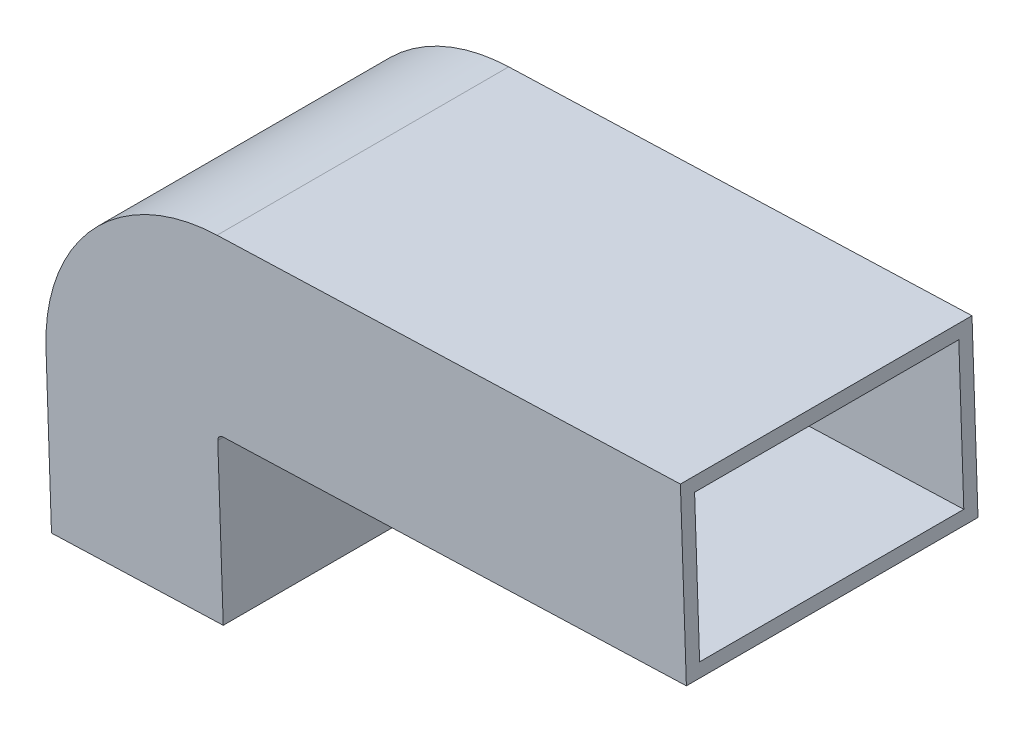
ISO-10303-21;
HEADER;
FILE_DESCRIPTION(('STEP AP214'),'2;1');
FILE_NAME('part.step','',(''),(''),'','','');
FILE_SCHEMA(('AUTOMOTIVE_DESIGN { 1 0 10303 214 1 1 1 1 }'));
ENDSEC;
DATA;
#1=APPLICATION_CONTEXT('core data for automotive mechanical design processes');
#2=APPLICATION_PROTOCOL_DEFINITION('international standard','automotive_design',2000,#1);
#3=PRODUCT_CONTEXT('',#1,'mechanical');
#4=PRODUCT('Part','Part','',(#3));
#5=PRODUCT_RELATED_PRODUCT_CATEGORY('part','',(#4));
#6=PRODUCT_DEFINITION_FORMATION('','',#4);
#7=PRODUCT_DEFINITION_CONTEXT('part definition',#1,'design');
#8=PRODUCT_DEFINITION('design','',#6,#7);
#9=PRODUCT_DEFINITION_SHAPE('','',#8);
#10=(LENGTH_UNIT() NAMED_UNIT(*) SI_UNIT(.MILLI.,.METRE.));
#11=(NAMED_UNIT(*) PLANE_ANGLE_UNIT() SI_UNIT($,.RADIAN.));
#12=(NAMED_UNIT(*) SI_UNIT($,.STERADIAN.) SOLID_ANGLE_UNIT());
#13=UNCERTAINTY_MEASURE_WITH_UNIT(LENGTH_MEASURE(1.E-05),#10,'distance_accuracy_value','');
#14=(GEOMETRIC_REPRESENTATION_CONTEXT(3) GLOBAL_UNCERTAINTY_ASSIGNED_CONTEXT((#13)) GLOBAL_UNIT_ASSIGNED_CONTEXT((#10,
#11,#12)) REPRESENTATION_CONTEXT('',''));
#15=CARTESIAN_POINT('',(0.,0.,0.));
#16=DIRECTION('',(0.,0.,1.));
#17=DIRECTION('',(1.,0.,0.));
#18=AXIS2_PLACEMENT_3D('',#15,#16,#17);
#19=CARTESIAN_POINT('',(-11.2698571129711,-23.0649926575875,0.));
#20=DIRECTION('',(-0.0348220741349177,0.999393527672129,0.));
#21=DIRECTION('',(-0.999393527672129,-0.0348220741349177,0.));
#22=AXIS2_PLACEMENT_3D('',#19,#20,#21);
#23=PLANE('',#22);
#24=DIRECTION('',(0.,0.,-1.));
#25=VECTOR('',#24,1.);
#26=CARTESIAN_POINT('',(-27.2435438908453,-23.6215671097783,28.9000634400757));
#27=LINE('',#26,#25);
#28=CARTESIAN_POINT('',(-27.2435438908453,-23.6215671097783,28.9000634400757));
#29=VERTEX_POINT('',#28);
#30=CARTESIAN_POINT('',(-27.2435438908453,-23.6215671097783,-28.9000634400757));
#31=VERTEX_POINT('',#30);
#32=EDGE_CURVE('E147',#29,#31,#27,.T.);
#33=ORIENTED_EDGE('',*,*,#32,.T.);
#34=DIRECTION('',(-0.999393527672129,-0.0348220741349177,0.));
#35=VECTOR('',#34,1.);
#36=CARTESIAN_POINT('',(-58.8270296980675,-24.7220369985317,-28.9000634400757));
#37=LINE('',#36,#35);
#38=CARTESIAN_POINT('',(-58.8270296980675,-24.7220369985317,-28.9000634400757));
#39=VERTEX_POINT('',#38);
#40=EDGE_CURVE('E157',#31,#39,#37,.T.);
#41=ORIENTED_EDGE('',*,*,#40,.T.);
#42=DIRECTION('',(0.,0.,1.));
#43=VECTOR('',#42,1.);
#44=CARTESIAN_POINT('',(-58.8270296980675,-24.7220369985317,28.9000634400757));
#45=LINE('',#44,#43);
#46=CARTESIAN_POINT('',(-58.8270296980675,-24.7220369985317,28.9000634400757));
#47=VERTEX_POINT('',#46);
#48=EDGE_CURVE('E169',#39,#47,#45,.T.);
#49=ORIENTED_EDGE('',*,*,#48,.T.);
#50=DIRECTION('',(0.999393527672129,0.0348220741349177,0.));
#51=VECTOR('',#50,1.);
#52=CARTESIAN_POINT('',(-58.8270296980675,-24.7220369985317,28.9000634400757));
#53=LINE('',#52,#51);
#54=EDGE_CURVE('E158',#47,#29,#53,.T.);
#55=ORIENTED_EDGE('',*,*,#54,.T.);
#56=EDGE_LOOP('',(#33,#41,#49,#55));
#57=FACE_BOUND('',#56,.T.);
#58=DIRECTION('',(-0.999393527672129,-0.0348220741349177,0.));
#59=VECTOR('',#58,1.);
#60=CARTESIAN_POINT('',(-11.2698571129711,-23.0649926575875,-31.9000634400757));
#61=LINE('',#60,#59);
#62=CARTESIAN_POINT('',(-24.2453633078289,-23.5171008873735,-31.9000634400757));
#63=VERTEX_POINT('',#62);
#64=CARTESIAN_POINT('',(-61.8252102810839,-24.8265032209364,-31.9000634400757));
#65=VERTEX_POINT('',#64);
#66=EDGE_CURVE('E273',#63,#65,#61,.T.);
#67=ORIENTED_EDGE('',*,*,#66,.F.);
#68=DIRECTION('',(0.,0.,-1.));
#69=VECTOR('',#68,1.);
#70=CARTESIAN_POINT('',(-24.2453633078289,-23.5171008873735,0.));
#71=LINE('',#70,#69);
#72=CARTESIAN_POINT('',(-24.2453633078289,-23.5171008873735,31.9000634400757));
#73=VERTEX_POINT('',#72);
#74=EDGE_CURVE('E270',#73,#63,#71,.T.);
#75=ORIENTED_EDGE('',*,*,#74,.F.);
#76=DIRECTION('',(0.999393527672129,0.0348220741349177,0.));
#77=VECTOR('',#76,1.);
#78=CARTESIAN_POINT('',(-11.2698571129711,-23.0649926575875,31.9000634400757));
#79=LINE('',#78,#77);
#80=CARTESIAN_POINT('',(-61.8252102810839,-24.8265032209364,31.9000634400757));
#81=VERTEX_POINT('',#80);
#82=EDGE_CURVE('E216',#81,#73,#79,.T.);
#83=ORIENTED_EDGE('',*,*,#82,.F.);
#84=DIRECTION('',(0.,0.,1.));
#85=VECTOR('',#84,1.);
#86=CARTESIAN_POINT('',(-61.8252102810839,-24.8265032209364,0.));
#87=LINE('',#86,#85);
#88=EDGE_CURVE('E224',#65,#81,#87,.T.);
#89=ORIENTED_EDGE('',*,*,#88,.F.);
#90=EDGE_LOOP('',(#67,#75,#83,#89));
#91=FACE_BOUND('',#90,.T.);
#92=ADVANCED_FACE('F33',(#57,#91),#23,.F.);
#93=CARTESIAN_POINT('',(77.5330758092369,2.70150089927657,0.));
#94=DIRECTION('',(0.999393527672129,0.0348220741349177,0.));
#95=DIRECTION('',(-0.0348220741349177,0.999393527672129,0.));
#96=AXIS2_PLACEMENT_3D('',#93,#94,#95);
#97=PLANE('',#96);
#98=DIRECTION('',(-0.0348220741349177,0.999393527672129,0.));
#99=VECTOR('',#98,1.);
#100=CARTESIAN_POINT('',(75.8760314682928,50.2586734843729,-28.9000634400757));
#101=LINE('',#100,#99);
#102=CARTESIAN_POINT('',(76.9765013570462,18.6751876771507,-28.9000634400757));
#103=VERTEX_POINT('',#102);
#104=CARTESIAN_POINT('',(75.8760314682928,50.2586734843729,-28.9000634400757));
#105=VERTEX_POINT('',#104);
#106=EDGE_CURVE('E200',#103,#105,#101,.T.);
#107=ORIENTED_EDGE('',*,*,#106,.F.);
#108=DIRECTION('',(0.,0.,-1.));
#109=VECTOR('',#108,1.);
#110=CARTESIAN_POINT('',(76.9765013570462,18.6751876771507,28.9000634400757));
#111=LINE('',#110,#109);
#112=CARTESIAN_POINT('',(76.9765013570462,18.6751876771507,28.9000634400757));
#113=VERTEX_POINT('',#112);
#114=EDGE_CURVE('E183',#113,#103,#111,.T.);
#115=ORIENTED_EDGE('',*,*,#114,.F.);
#116=DIRECTION('',(0.0348220741349177,-0.999393527672129,0.));
#117=VECTOR('',#116,1.);
#118=CARTESIAN_POINT('',(75.8760314682928,50.2586734843729,28.9000634400757));
#119=LINE('',#118,#117);
#120=CARTESIAN_POINT('',(75.8760314682928,50.2586734843729,28.9000634400757));
#121=VERTEX_POINT('',#120);
#122=EDGE_CURVE('E179',#121,#113,#119,.T.);
#123=ORIENTED_EDGE('',*,*,#122,.F.);
#124=DIRECTION('',(0.,0.,1.));
#125=VECTOR('',#124,1.);
#126=CARTESIAN_POINT('',(75.8760314682928,50.2586734843729,28.9000634400757));
#127=LINE('',#126,#125);
#128=EDGE_CURVE('E210',#105,#121,#127,.T.);
#129=ORIENTED_EDGE('',*,*,#128,.F.);
#130=EDGE_LOOP('',(#107,#115,#123,#129));
#131=FACE_BOUND('',#130,.T.);
#132=DIRECTION('',(-0.0348220741349177,0.999393527672129,0.));
#133=VECTOR('',#132,1.);
#134=CARTESIAN_POINT('',(77.5330758092369,2.70150089927657,-31.9000634400757));
#135=LINE('',#134,#133);
#136=CARTESIAN_POINT('',(77.0809675794509,15.6770070941344,-31.9000634400757));
#137=VERTEX_POINT('',#136);
#138=CARTESIAN_POINT('',(75.771565245888,53.2568540673893,-31.9000634400757));
#139=VERTEX_POINT('',#138);
#140=EDGE_CURVE('E265',#137,#139,#135,.T.);
#141=ORIENTED_EDGE('',*,*,#140,.T.);
#142=DIRECTION('',(0.,0.,1.));
#143=VECTOR('',#142,1.);
#144=CARTESIAN_POINT('',(75.771565245888,53.2568540673893,0.));
#145=LINE('',#144,#143);
#146=CARTESIAN_POINT('',(75.771565245888,53.2568540673893,31.9000634400757));
#147=VERTEX_POINT('',#146);
#148=EDGE_CURVE('E11',#139,#147,#145,.T.);
#149=ORIENTED_EDGE('',*,*,#148,.T.);
#150=DIRECTION('',(0.0348220741349177,-0.999393527672129,0.));
#151=VECTOR('',#150,1.);
#152=CARTESIAN_POINT('',(77.5330758092369,2.70150089927657,31.9000634400757));
#153=LINE('',#152,#151);
#154=CARTESIAN_POINT('',(77.0809675794509,15.6770070941344,31.9000634400757));
#155=VERTEX_POINT('',#154);
#156=EDGE_CURVE('E259',#147,#155,#153,.T.);
#157=ORIENTED_EDGE('',*,*,#156,.T.);
#158=DIRECTION('',(0.,0.,-1.));
#159=VECTOR('',#158,1.);
#160=CARTESIAN_POINT('',(77.0809675794509,15.6770070941344,0.));
#161=LINE('',#160,#159);
#162=EDGE_CURVE('E258',#155,#137,#161,.T.);
#163=ORIENTED_EDGE('',*,*,#162,.T.);
#164=EDGE_LOOP('',(#141,#149,#157,#163));
#165=FACE_BOUND('',#164,.T.);
#166=ADVANCED_FACE('F282',(#131,#165),#97,.T.);
#167=CARTESIAN_POINT('',(-58.8270296980675,-24.7220369985317,31.9000634400757));
#168=DIRECTION('',(0.,0.,1.));
#169=DIRECTION('',(1.,0.,0.));
#170=AXIS2_PLACEMENT_3D('',#167,#168,#169);
#171=PLANE('',#170);
#172=DIRECTION('',(-0.0348220741349174,0.999393527672129,0.));
#173=VECTOR('',#172,1.);
#174=CARTESIAN_POINT('',(-24.2453633078289,-23.5171008873735,31.9000634400757));
#175=LINE('',#174,#173);
#176=CARTESIAN_POINT('',(-25.4447494372211,10.9052810261837,31.9000634400757));
#177=VERTEX_POINT('',#176);
#178=EDGE_CURVE('E217',#73,#177,#175,.T.);
#179=ORIENTED_EDGE('',*,*,#178,.T.);
#180=CARTESIAN_POINT('',(-24.246802370406,10.9470213421007,31.9000634400757));
#181=DIRECTION('',(0.,0.,1.));
#182=DIRECTION('',(1.,0.,0.));
#183=AXIS2_PLACEMENT_3D('',#180,#181,#182);
#184=CIRCLE('',#183,1.1986740294441);
#185=CARTESIAN_POINT('',(-24.288542686323,12.1449684089157,31.9000634400757));
#186=VERTEX_POINT('',#185);
#187=EDGE_CURVE('E237',#177,#186,#184,.F.);
#188=ORIENTED_EDGE('',*,*,#187,.T.);
#189=DIRECTION('',(0.999393527672129,0.0348220741349174,0.));
#190=VECTOR('',#189,1.);
#191=CARTESIAN_POINT('',(-24.2885426863228,12.1449684089158,31.9000634400757));
#192=LINE('',#191,#190);
#193=EDGE_CURVE('E255',#186,#155,#192,.T.);
#194=ORIENTED_EDGE('',*,*,#193,.T.);
#195=ORIENTED_EDGE('',*,*,#156,.F.);
#196=DIRECTION('',(0.999393527672129,0.0348220741349174,0.));
#197=VECTOR('',#196,1.);
#198=CARTESIAN_POINT('',(-25.5979450198857,49.7248153821707,31.9000634400757));
#199=LINE('',#198,#197);
#200=CARTESIAN_POINT('',(-25.5979450198859,49.7248153821707,31.9000634400757));
#201=VERTEX_POINT('',#200);
#202=EDGE_CURVE('E254',#201,#147,#199,.T.);
#203=ORIENTED_EDGE('',*,*,#202,.F.);
#204=CARTESIAN_POINT('',(-24.246802370406,10.9470213421007,31.9000634400757));
#205=DIRECTION('',(0.,0.,1.));
#206=DIRECTION('',(1.,0.,0.));
#207=AXIS2_PLACEMENT_3D('',#204,#205,#206);
#208=CIRCLE('',#207,38.8013259705559);
#209=CARTESIAN_POINT('',(-63.0245964104761,9.59587869262079,31.9000634400757));
#210=VERTEX_POINT('',#209);
#211=EDGE_CURVE('E236',#210,#201,#208,.F.);
#212=ORIENTED_EDGE('',*,*,#211,.F.);
#213=DIRECTION('',(-0.0348220741349174,0.999393527672129,0.));
#214=VECTOR('',#213,1.);
#215=CARTESIAN_POINT('',(-61.8252102810839,-24.8265032209364,31.9000634400757));
#216=LINE('',#215,#214);
#217=EDGE_CURVE('E221',#81,#210,#216,.T.);
#218=ORIENTED_EDGE('',*,*,#217,.F.);
#219=ORIENTED_EDGE('',*,*,#82,.T.);
#220=EDGE_LOOP('',(#179,#188,#194,#195,#203,#212,#218,#219));
#221=FACE_BOUND('',#220,.T.);
#222=ADVANCED_FACE('F297',(#221),#171,.T.);
#223=CARTESIAN_POINT('',(-24.2453633078289,-23.5171008873735,28.9000634400757));
#224=DIRECTION('',(0.999393527672129,0.0348220741349174,0.));
#225=DIRECTION('',(-0.0348220741349174,0.999393527672129,0.));
#226=AXIS2_PLACEMENT_3D('',#223,#224,#225);
#227=PLANE('',#226);
#228=DIRECTION('',(-0.0348220741349174,0.999393527672129,0.));
#229=VECTOR('',#228,1.);
#230=CARTESIAN_POINT('',(-24.2453633078289,-23.5171008873735,-31.9000634400757));
#231=LINE('',#230,#229);
#232=CARTESIAN_POINT('',(-25.4447494372211,10.9052810261837,-31.9000634400757));
#233=VERTEX_POINT('',#232);
#234=EDGE_CURVE('E225',#63,#233,#231,.T.);
#235=ORIENTED_EDGE('',*,*,#234,.T.);
#236=DIRECTION('',(0.,0.,-1.));
#237=VECTOR('',#236,1.);
#238=CARTESIAN_POINT('',(-25.4447494372211,10.9052810261837,0.));
#239=LINE('',#238,#237);
#240=EDGE_CURVE('E220',#177,#233,#239,.T.);
#241=ORIENTED_EDGE('',*,*,#240,.F.);
#242=ORIENTED_EDGE('',*,*,#178,.F.);
#243=ORIENTED_EDGE('',*,*,#74,.T.);
#244=EDGE_LOOP('',(#235,#241,#242,#243));
#245=FACE_BOUND('',#244,.T.);
#246=ADVANCED_FACE('F307',(#245),#227,.T.);
#247=CARTESIAN_POINT('',(-58.8270296980675,-24.7220369985317,-31.9000634400757));
#248=DIRECTION('',(0.,0.,-1.));
#249=DIRECTION('',(-1.,0.,0.));
#250=AXIS2_PLACEMENT_3D('',#247,#248,#249);
#251=PLANE('',#250);
#252=DIRECTION('',(-0.0348220741349174,0.999393527672129,0.));
#253=VECTOR('',#252,1.);
#254=CARTESIAN_POINT('',(-61.8252102810839,-24.8265032209364,-31.9000634400757));
#255=LINE('',#254,#253);
#256=CARTESIAN_POINT('',(-63.0245964104761,9.59587869262079,-31.9000634400757));
#257=VERTEX_POINT('',#256);
#258=EDGE_CURVE('E228',#65,#257,#255,.T.);
#259=ORIENTED_EDGE('',*,*,#258,.T.);
#260=CARTESIAN_POINT('',(-24.246802370406,10.9470213421007,-31.9000634400757));
#261=DIRECTION('',(0.,0.,-1.));
#262=DIRECTION('',(-1.,0.,0.));
#263=AXIS2_PLACEMENT_3D('',#260,#261,#262);
#264=CIRCLE('',#263,38.8013259705559);
#265=CARTESIAN_POINT('',(-25.5979450198859,49.7248153821707,-31.9000634400757));
#266=VERTEX_POINT('',#265);
#267=EDGE_CURVE('E246',#257,#266,#264,.T.);
#268=ORIENTED_EDGE('',*,*,#267,.T.);
#269=DIRECTION('',(0.999393527672129,0.0348220741349174,0.));
#270=VECTOR('',#269,1.);
#271=CARTESIAN_POINT('',(-25.5979450198857,49.7248153821707,-31.9000634400757));
#272=LINE('',#271,#270);
#273=EDGE_CURVE('E41',#266,#139,#272,.T.);
#274=ORIENTED_EDGE('',*,*,#273,.T.);
#275=ORIENTED_EDGE('',*,*,#140,.F.);
#276=DIRECTION('',(0.999393527672129,0.0348220741349174,0.));
#277=VECTOR('',#276,1.);
#278=CARTESIAN_POINT('',(-24.2885426863228,12.1449684089158,-31.9000634400757));
#279=LINE('',#278,#277);
#280=CARTESIAN_POINT('',(-24.288542686323,12.1449684089158,-31.9000634400757));
#281=VERTEX_POINT('',#280);
#282=EDGE_CURVE('E262',#281,#137,#279,.T.);
#283=ORIENTED_EDGE('',*,*,#282,.F.);
#284=CARTESIAN_POINT('',(-24.246802370406,10.9470213421007,-31.9000634400757));
#285=DIRECTION('',(0.,0.,-1.));
#286=DIRECTION('',(-1.,0.,0.));
#287=AXIS2_PLACEMENT_3D('',#284,#285,#286);
#288=CIRCLE('',#287,1.1986740294441);
#289=EDGE_CURVE('E243',#233,#281,#288,.T.);
#290=ORIENTED_EDGE('',*,*,#289,.F.);
#291=ORIENTED_EDGE('',*,*,#234,.F.);
#292=ORIENTED_EDGE('',*,*,#66,.T.);
#293=EDGE_LOOP('',(#259,#268,#274,#275,#283,#290,#291,#292));
#294=FACE_BOUND('',#293,.T.);
#295=ADVANCED_FACE('F288',(#294),#251,.T.);
#296=CARTESIAN_POINT('',(-61.8252102810839,-24.8265032209364,28.9000634400757));
#297=DIRECTION('',(-0.999393527672129,-0.0348220741349174,0.));
#298=DIRECTION('',(0.0348220741349174,-0.999393527672129,0.));
#299=AXIS2_PLACEMENT_3D('',#296,#297,#298);
#300=PLANE('',#299);
#301=DIRECTION('',(0.,0.,-1.));
#302=VECTOR('',#301,1.);
#303=CARTESIAN_POINT('',(-63.0245964104761,9.59587869262073,0.));
#304=LINE('',#303,#302);
#305=EDGE_CURVE('E233',#257,#210,#304,.F.);
#306=ORIENTED_EDGE('',*,*,#305,.F.);
#307=ORIENTED_EDGE('',*,*,#258,.F.);
#308=ORIENTED_EDGE('',*,*,#88,.T.);
#309=ORIENTED_EDGE('',*,*,#217,.T.);
#310=EDGE_LOOP('',(#306,#307,#308,#309));
#311=FACE_BOUND('',#310,.T.);
#312=ADVANCED_FACE('F294',(#311),#300,.T.);
#313=CARTESIAN_POINT('',(-24.246802370406,10.9470213421007,0.));
#314=DIRECTION('',(0.,0.,-1.));
#315=DIRECTION('',(-1.,0.,0.));
#316=AXIS2_PLACEMENT_3D('',#313,#314,#315);
#317=CYLINDRICAL_SURFACE('',#316,1.1986740294441);
#318=ORIENTED_EDGE('',*,*,#289,.T.);
#319=DIRECTION('',(0.,0.,1.));
#320=VECTOR('',#319,1.);
#321=CARTESIAN_POINT('',(-24.288542686323,12.1449684089157,28.9000634400757));
#322=LINE('',#321,#320);
#323=EDGE_CURVE('E240',#186,#281,#322,.F.);
#324=ORIENTED_EDGE('',*,*,#323,.F.);
#325=ORIENTED_EDGE('',*,*,#187,.F.);
#326=ORIENTED_EDGE('',*,*,#240,.T.);
#327=EDGE_LOOP('',(#318,#324,#325,#326));
#328=FACE_BOUND('',#327,.T.);
#329=ADVANCED_FACE('F304',(#328),#317,.F.);
#330=CARTESIAN_POINT('',(-24.246802370406,10.9470213421007,0.));
#331=DIRECTION('',(0.,0.,-1.));
#332=DIRECTION('',(-1.,0.,0.));
#333=AXIS2_PLACEMENT_3D('',#330,#331,#332);
#334=CYLINDRICAL_SURFACE('',#333,38.8013259705559);
#335=DIRECTION('',(0.,0.,1.));
#336=VECTOR('',#335,1.);
#337=CARTESIAN_POINT('',(-25.5979450198859,49.7248153821707,28.9000634400757));
#338=LINE('',#337,#336);
#339=EDGE_CURVE('E251',#266,#201,#338,.T.);
#340=ORIENTED_EDGE('',*,*,#339,.F.);
#341=ORIENTED_EDGE('',*,*,#267,.F.);
#342=ORIENTED_EDGE('',*,*,#305,.T.);
#343=ORIENTED_EDGE('',*,*,#211,.T.);
#344=EDGE_LOOP('',(#340,#341,#342,#343));
#345=FACE_BOUND('',#344,.T.);
#346=ADVANCED_FACE('F292',(#345),#334,.T.);
#347=CARTESIAN_POINT('',(-24.2885426863228,12.1449684089158,28.9000634400757));
#348=DIRECTION('',(0.0348220741349174,-0.999393527672129,0.));
#349=DIRECTION('',(0.999393527672129,0.0348220741349174,0.));
#350=AXIS2_PLACEMENT_3D('',#347,#348,#349);
#351=PLANE('',#350);
#352=ORIENTED_EDGE('',*,*,#282,.T.);
#353=ORIENTED_EDGE('',*,*,#162,.F.);
#354=ORIENTED_EDGE('',*,*,#193,.F.);
#355=ORIENTED_EDGE('',*,*,#323,.T.);
#356=EDGE_LOOP('',(#352,#353,#354,#355));
#357=FACE_BOUND('',#356,.T.);
#358=ADVANCED_FACE('F300',(#357),#351,.T.);
#359=CARTESIAN_POINT('',(-25.5979450198857,49.7248153821707,28.9000634400757));
#360=DIRECTION('',(-0.0348220741349174,0.999393527672129,0.));
#361=DIRECTION('',(-0.999393527672129,-0.0348220741349174,0.));
#362=AXIS2_PLACEMENT_3D('',#359,#360,#361);
#363=PLANE('',#362);
#364=ORIENTED_EDGE('',*,*,#148,.F.);
#365=ORIENTED_EDGE('',*,*,#273,.F.);
#366=ORIENTED_EDGE('',*,*,#339,.T.);
#367=ORIENTED_EDGE('',*,*,#202,.T.);
#368=EDGE_LOOP('',(#364,#365,#366,#367));
#369=FACE_BOUND('',#368,.T.);
#370=ADVANCED_FACE('F35',(#369),#363,.T.);
#371=CARTESIAN_POINT('',(-58.8270296980675,-24.7220369985317,28.9000634400757));
#372=DIRECTION('',(0.,0.,1.));
#373=DIRECTION('',(1.,0.,0.));
#374=AXIS2_PLACEMENT_3D('',#371,#372,#373);
#375=PLANE('',#374);
#376=DIRECTION('',(-0.0348220741349174,0.999393527672129,0.));
#377=VECTOR('',#376,1.);
#378=CARTESIAN_POINT('',(-27.2435438908453,-23.6215671097783,28.9000634400757));
#379=LINE('',#378,#377);
#380=CARTESIAN_POINT('',(-28.4429300202375,10.8008148037789,28.9000634400757));
#381=VERTEX_POINT('',#380);
#382=EDGE_CURVE('E151',#29,#381,#379,.T.);
#383=ORIENTED_EDGE('',*,*,#382,.F.);
#384=ORIENTED_EDGE('',*,*,#54,.F.);
#385=DIRECTION('',(-0.0348220741349174,0.999393527672129,0.));
#386=VECTOR('',#385,1.);
#387=CARTESIAN_POINT('',(-58.8270296980675,-24.7220369985317,28.9000634400757));
#388=LINE('',#387,#386);
#389=CARTESIAN_POINT('',(-60.0264158274597,9.70034491502549,28.9000634400757));
#390=VERTEX_POINT('',#389);
#391=EDGE_CURVE('E48',#47,#390,#388,.T.);
#392=ORIENTED_EDGE('',*,*,#391,.T.);
#393=CARTESIAN_POINT('',(-24.246802370406,10.9470213421007,28.9000634400757));
#394=DIRECTION('',(0.,0.,-1.));
#395=DIRECTION('',(-0.999393527672129,-0.0348220741349247,0.));
#396=AXIS2_PLACEMENT_3D('',#393,#394,#395);
#397=CIRCLE('',#396,35.8013259705559);
#398=CARTESIAN_POINT('',(-25.4934787974811,46.7266347991543,28.9000634400757));
#399=VERTEX_POINT('',#398);
#400=EDGE_CURVE('E175',#390,#399,#397,.T.);
#401=ORIENTED_EDGE('',*,*,#400,.T.);
#402=DIRECTION('',(0.999393527672129,0.0348220741349174,0.));
#403=VECTOR('',#402,1.);
#404=CARTESIAN_POINT('',(-25.4934787974809,46.7266347991543,28.9000634400757));
#405=LINE('',#404,#403);
#406=EDGE_CURVE('E181',#399,#121,#405,.T.);
#407=ORIENTED_EDGE('',*,*,#406,.T.);
#408=ORIENTED_EDGE('',*,*,#122,.T.);
#409=DIRECTION('',(0.999393527672129,0.0348220741349174,0.));
#410=VECTOR('',#409,1.);
#411=CARTESIAN_POINT('',(-24.3930089087275,15.1431489919321,28.9000634400757));
#412=LINE('',#411,#410);
#413=CARTESIAN_POINT('',(-24.3930089087277,15.1431489919321,28.9000634400757));
#414=VERTEX_POINT('',#413);
#415=EDGE_CURVE('E56',#414,#113,#412,.T.);
#416=ORIENTED_EDGE('',*,*,#415,.F.);
#417=CARTESIAN_POINT('',(-24.246802370406,10.9470213421007,28.9000634400757));
#418=DIRECTION('',(0.,0.,-1.));
#419=DIRECTION('',(-0.999393527672129,-0.034822074134918,0.));
#420=AXIS2_PLACEMENT_3D('',#417,#418,#419);
#421=CIRCLE('',#420,4.1986740294441);
#422=EDGE_CURVE('E164',#381,#414,#421,.T.);
#423=ORIENTED_EDGE('',*,*,#422,.F.);
#424=EDGE_LOOP('',(#383,#384,#392,#401,#407,#408,#416,#423));
#425=FACE_BOUND('',#424,.T.);
#426=ADVANCED_FACE('F161',(#425),#375,.F.);
#427=CARTESIAN_POINT('',(-27.2435438908453,-23.6215671097783,28.9000634400757));
#428=DIRECTION('',(0.999393527672129,0.0348220741349174,0.));
#429=DIRECTION('',(-0.0348220741349174,0.999393527672129,0.));
#430=AXIS2_PLACEMENT_3D('',#427,#428,#429);
#431=PLANE('',#430);
#432=DIRECTION('',(-0.0348220741349174,0.999393527672129,0.));
#433=VECTOR('',#432,1.);
#434=CARTESIAN_POINT('',(-27.2435438908453,-23.6215671097783,-28.9000634400757));
#435=LINE('',#434,#433);
#436=CARTESIAN_POINT('',(-28.4429300202375,10.8008148037789,-28.9000634400757));
#437=VERTEX_POINT('',#436);
#438=EDGE_CURVE('E153',#31,#437,#435,.T.);
#439=ORIENTED_EDGE('',*,*,#438,.F.);
#440=ORIENTED_EDGE('',*,*,#32,.F.);
#441=ORIENTED_EDGE('',*,*,#382,.T.);
#442=DIRECTION('',(0.,0.,-1.));
#443=VECTOR('',#442,1.);
#444=CARTESIAN_POINT('',(-28.4429300202375,10.8008148037789,28.9000634400757));
#445=LINE('',#444,#443);
#446=EDGE_CURVE('E166',#381,#437,#445,.T.);
#447=ORIENTED_EDGE('',*,*,#446,.T.);
#448=EDGE_LOOP('',(#439,#440,#441,#447));
#449=FACE_BOUND('',#448,.T.);
#450=ADVANCED_FACE('F149',(#449),#431,.F.);
#451=CARTESIAN_POINT('',(-58.8270296980675,-24.7220369985317,-28.9000634400757));
#452=DIRECTION('',(0.,0.,-1.));
#453=DIRECTION('',(-1.,0.,0.));
#454=AXIS2_PLACEMENT_3D('',#451,#452,#453);
#455=PLANE('',#454);
#456=DIRECTION('',(-0.0348220741349174,0.999393527672129,0.));
#457=VECTOR('',#456,1.);
#458=CARTESIAN_POINT('',(-58.8270296980675,-24.7220369985317,-28.9000634400757));
#459=LINE('',#458,#457);
#460=CARTESIAN_POINT('',(-60.0264158274597,9.70034491502549,-28.9000634400757));
#461=VERTEX_POINT('',#460);
#462=EDGE_CURVE('E189',#39,#461,#459,.T.);
#463=ORIENTED_EDGE('',*,*,#462,.F.);
#464=ORIENTED_EDGE('',*,*,#40,.F.);
#465=ORIENTED_EDGE('',*,*,#438,.T.);
#466=CARTESIAN_POINT('',(-24.246802370406,10.9470213421007,-28.9000634400757));
#467=DIRECTION('',(0.,0.,-1.));
#468=DIRECTION('',(-0.999393527672129,-0.034822074134918,0.));
#469=AXIS2_PLACEMENT_3D('',#466,#467,#468);
#470=CIRCLE('',#469,4.1986740294441);
#471=CARTESIAN_POINT('',(-24.3930089087277,15.1431489919321,-28.9000634400757));
#472=VERTEX_POINT('',#471);
#473=EDGE_CURVE('E192',#437,#472,#470,.T.);
#474=ORIENTED_EDGE('',*,*,#473,.T.);
#475=DIRECTION('',(0.999393527672129,0.0348220741349174,0.));
#476=VECTOR('',#475,1.);
#477=CARTESIAN_POINT('',(-24.3930089087275,15.1431489919321,-28.9000634400757));
#478=LINE('',#477,#476);
#479=EDGE_CURVE('E197',#472,#103,#478,.T.);
#480=ORIENTED_EDGE('',*,*,#479,.T.);
#481=ORIENTED_EDGE('',*,*,#106,.T.);
#482=DIRECTION('',(0.999393527672129,0.0348220741349174,0.));
#483=VECTOR('',#482,1.);
#484=CARTESIAN_POINT('',(-25.4934787974809,46.7266347991543,-28.9000634400757));
#485=LINE('',#484,#483);
#486=CARTESIAN_POINT('',(-25.4934787974811,46.7266347991543,-28.9000634400757));
#487=VERTEX_POINT('',#486);
#488=EDGE_CURVE('E207',#487,#105,#485,.T.);
#489=ORIENTED_EDGE('',*,*,#488,.F.);
#490=CARTESIAN_POINT('',(-24.246802370406,10.9470213421007,-28.9000634400757));
#491=DIRECTION('',(0.,0.,-1.));
#492=DIRECTION('',(-0.999393527672129,-0.0348220741349247,0.));
#493=AXIS2_PLACEMENT_3D('',#490,#491,#492);
#494=CIRCLE('',#493,35.8013259705559);
#495=EDGE_CURVE('E195',#461,#487,#494,.T.);
#496=ORIENTED_EDGE('',*,*,#495,.F.);
#497=EDGE_LOOP('',(#463,#464,#465,#474,#480,#481,#489,#496));
#498=FACE_BOUND('',#497,.T.);
#499=ADVANCED_FACE('F389',(#498),#455,.F.);
#500=CARTESIAN_POINT('',(-58.8270296980675,-24.7220369985317,28.9000634400757));
#501=DIRECTION('',(-0.999393527672129,-0.0348220741349174,0.));
#502=DIRECTION('',(0.0348220741349174,-0.999393527672129,0.));
#503=AXIS2_PLACEMENT_3D('',#500,#501,#502);
#504=PLANE('',#503);
#505=DIRECTION('',(0.,0.,1.));
#506=VECTOR('',#505,1.);
#507=CARTESIAN_POINT('',(-60.0264158274597,9.70034491502549,28.9000634400757));
#508=LINE('',#507,#506);
#509=EDGE_CURVE('E178',#461,#390,#508,.T.);
#510=ORIENTED_EDGE('',*,*,#509,.T.);
#511=ORIENTED_EDGE('',*,*,#391,.F.);
#512=ORIENTED_EDGE('',*,*,#48,.F.);
#513=ORIENTED_EDGE('',*,*,#462,.T.);
#514=EDGE_LOOP('',(#510,#511,#512,#513));
#515=FACE_BOUND('',#514,.T.);
#516=ADVANCED_FACE('F399',(#515),#504,.F.);
#517=CARTESIAN_POINT('',(-24.246802370406,10.9470213421007,0.));
#518=DIRECTION('',(0.,0.,-1.));
#519=DIRECTION('',(-1.,0.,0.));
#520=AXIS2_PLACEMENT_3D('',#517,#518,#519);
#521=CYLINDRICAL_SURFACE('',#520,4.1986740294441);
#522=ORIENTED_EDGE('',*,*,#473,.F.);
#523=ORIENTED_EDGE('',*,*,#446,.F.);
#524=ORIENTED_EDGE('',*,*,#422,.T.);
#525=DIRECTION('',(0.,0.,-1.));
#526=VECTOR('',#525,1.);
#527=CARTESIAN_POINT('',(-24.3930089087278,15.1431489919327,28.9000634400757));
#528=LINE('',#527,#526);
#529=EDGE_CURVE('E174',#414,#472,#528,.T.);
#530=ORIENTED_EDGE('',*,*,#529,.T.);
#531=EDGE_LOOP('',(#522,#523,#524,#530));
#532=FACE_BOUND('',#531,.T.);
#533=ADVANCED_FACE('F410',(#532),#521,.T.);
#534=CARTESIAN_POINT('',(-24.246802370406,10.9470213421007,0.));
#535=DIRECTION('',(0.,0.,-1.));
#536=DIRECTION('',(-1.,0.,0.));
#537=AXIS2_PLACEMENT_3D('',#534,#535,#536);
#538=CYLINDRICAL_SURFACE('',#537,35.8013259705559);
#539=DIRECTION('',(0.,0.,1.));
#540=VECTOR('',#539,1.);
#541=CARTESIAN_POINT('',(-25.4934787974812,46.7266347991549,28.9000634400757));
#542=LINE('',#541,#540);
#543=EDGE_CURVE('E185',#487,#399,#542,.T.);
#544=ORIENTED_EDGE('',*,*,#543,.T.);
#545=ORIENTED_EDGE('',*,*,#400,.F.);
#546=ORIENTED_EDGE('',*,*,#509,.F.);
#547=ORIENTED_EDGE('',*,*,#495,.T.);
#548=EDGE_LOOP('',(#544,#545,#546,#547));
#549=FACE_BOUND('',#548,.T.);
#550=ADVANCED_FACE('F419',(#549),#538,.F.);
#551=CARTESIAN_POINT('',(-24.3930089087275,15.1431489919321,28.9000634400757));
#552=DIRECTION('',(0.0348220741349174,-0.999393527672129,0.));
#553=DIRECTION('',(0.999393527672129,0.0348220741349174,0.));
#554=AXIS2_PLACEMENT_3D('',#551,#552,#553);
#555=PLANE('',#554);
#556=ORIENTED_EDGE('',*,*,#479,.F.);
#557=ORIENTED_EDGE('',*,*,#529,.F.);
#558=ORIENTED_EDGE('',*,*,#415,.T.);
#559=ORIENTED_EDGE('',*,*,#114,.T.);
#560=EDGE_LOOP('',(#556,#557,#558,#559));
#561=FACE_BOUND('',#560,.T.);
#562=ADVANCED_FACE('F318',(#561),#555,.F.);
#563=CARTESIAN_POINT('',(-25.4934787974809,46.7266347991543,28.9000634400757));
#564=DIRECTION('',(-0.0348220741349174,0.999393527672129,0.));
#565=DIRECTION('',(-0.999393527672129,-0.0348220741349174,0.));
#566=AXIS2_PLACEMENT_3D('',#563,#564,#565);
#567=PLANE('',#566);
#568=ORIENTED_EDGE('',*,*,#128,.T.);
#569=ORIENTED_EDGE('',*,*,#406,.F.);
#570=ORIENTED_EDGE('',*,*,#543,.F.);
#571=ORIENTED_EDGE('',*,*,#488,.T.);
#572=EDGE_LOOP('',(#568,#569,#570,#571));
#573=FACE_BOUND('',#572,.T.);
#574=ADVANCED_FACE('F310',(#573),#567,.F.);
#575=CLOSED_SHELL('',(#92,#166,#222,#246,#295,#312,#329,#346,#358,#370,#426,#450,#499,#516,#533,
#550,#562,#574));
#576=MANIFOLD_SOLID_BREP('B2',#575);
#577=ADVANCED_BREP_SHAPE_REPRESENTATION('',(#18,#576),#14);
#578=SHAPE_DEFINITION_REPRESENTATION(#9,#577);
ENDSEC;
END-ISO-10303-21;
